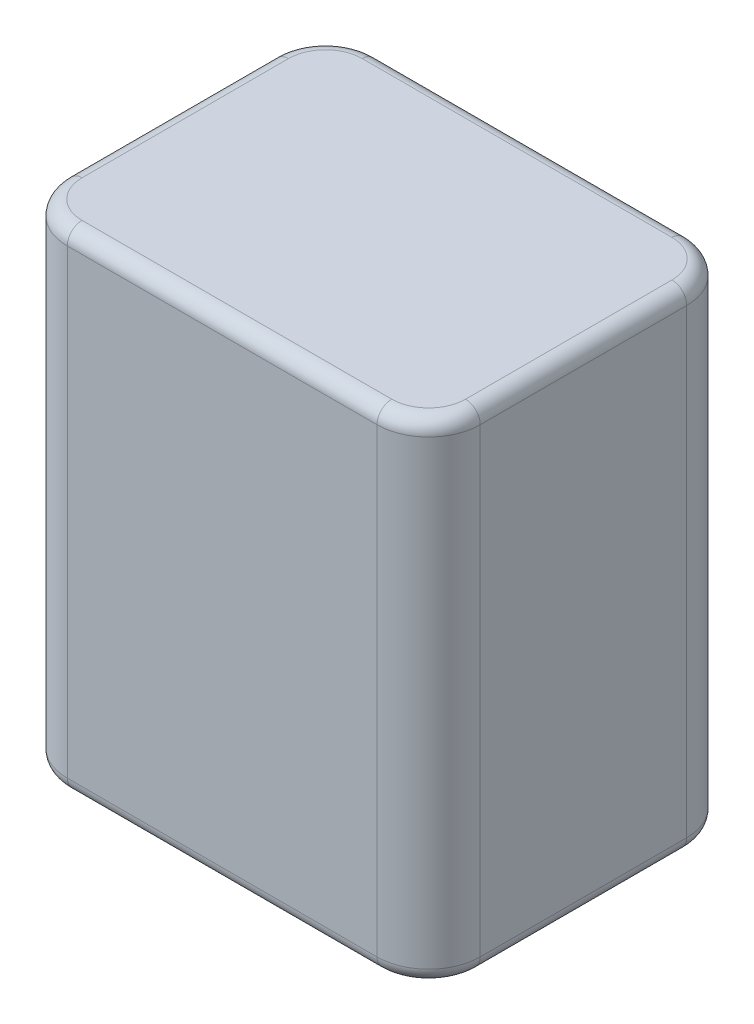
ISO-10303-21;
HEADER;
FILE_DESCRIPTION(('STEP AP214'),'2;1');
FILE_NAME('part.step','',(''),(''),'','','');
FILE_SCHEMA(('AUTOMOTIVE_DESIGN { 1 0 10303 214 1 1 1 1 }'));
ENDSEC;
DATA;
#1=APPLICATION_CONTEXT('core data for automotive mechanical design processes');
#2=APPLICATION_PROTOCOL_DEFINITION('international standard','automotive_design',2000,#1);
#3=PRODUCT_CONTEXT('',#1,'mechanical');
#4=PRODUCT('Part','Part','',(#3));
#5=PRODUCT_RELATED_PRODUCT_CATEGORY('part','',(#4));
#6=PRODUCT_DEFINITION_FORMATION('','',#4);
#7=PRODUCT_DEFINITION_CONTEXT('part definition',#1,'design');
#8=PRODUCT_DEFINITION('design','',#6,#7);
#9=PRODUCT_DEFINITION_SHAPE('','',#8);
#10=(LENGTH_UNIT() NAMED_UNIT(*) SI_UNIT(.MILLI.,.METRE.));
#11=(NAMED_UNIT(*) PLANE_ANGLE_UNIT() SI_UNIT($,.RADIAN.));
#12=(NAMED_UNIT(*) SI_UNIT($,.STERADIAN.) SOLID_ANGLE_UNIT());
#13=UNCERTAINTY_MEASURE_WITH_UNIT(LENGTH_MEASURE(1.E-05),#10,'distance_accuracy_value','');
#14=(GEOMETRIC_REPRESENTATION_CONTEXT(3) GLOBAL_UNCERTAINTY_ASSIGNED_CONTEXT((#13)) GLOBAL_UNIT_ASSIGNED_CONTEXT((#10,
#11,#12)) REPRESENTATION_CONTEXT('',''));
#15=CARTESIAN_POINT('',(0.,0.,0.));
#16=DIRECTION('',(0.,0.,1.));
#17=DIRECTION('',(1.,0.,0.));
#18=AXIS2_PLACEMENT_3D('',#15,#16,#17);
#19=CARTESIAN_POINT('',(-21.,66.5,14.));
#20=DIRECTION('',(0.,-1.,0.));
#21=DIRECTION('',(0.,0.,-1.));
#22=AXIS2_PLACEMENT_3D('',#19,#20,#21);
#23=CYLINDRICAL_SURFACE('',#22,7.);
#24=DIRECTION('',(0.,-1.,0.));
#25=VECTOR('',#24,1.);
#26=CARTESIAN_POINT('',(-28.,66.5,14.));
#27=LINE('',#26,#25);
#28=CARTESIAN_POINT('',(-28.,64.5,14.));
#29=VERTEX_POINT('',#28);
#30=CARTESIAN_POINT('',(-28.,2.,14.));
#31=VERTEX_POINT('',#30);
#32=EDGE_CURVE('E320',#29,#31,#27,.T.);
#33=ORIENTED_EDGE('',*,*,#32,.T.);
#34=CARTESIAN_POINT('',(-21.,2.,14.));
#35=DIRECTION('',(0.,-1.,0.));
#36=DIRECTION('',(0.,0.,-1.));
#37=AXIS2_PLACEMENT_3D('',#34,#35,#36);
#38=CIRCLE('',#37,7.);
#39=CARTESIAN_POINT('',(-21.,2.,21.));
#40=VERTEX_POINT('',#39);
#41=EDGE_CURVE('E269',#31,#40,#38,.F.);
#42=ORIENTED_EDGE('',*,*,#41,.T.);
#43=DIRECTION('',(0.,-1.,0.));
#44=VECTOR('',#43,1.);
#45=CARTESIAN_POINT('',(-21.,66.5,21.));
#46=LINE('',#45,#44);
#47=CARTESIAN_POINT('',(-21.,64.5,21.));
#48=VERTEX_POINT('',#47);
#49=EDGE_CURVE('E184',#48,#40,#46,.T.);
#50=ORIENTED_EDGE('',*,*,#49,.F.);
#51=CARTESIAN_POINT('',(-21.,64.5,14.));
#52=DIRECTION('',(0.,-1.,0.));
#53=DIRECTION('',(0.,0.,-1.));
#54=AXIS2_PLACEMENT_3D('',#51,#52,#53);
#55=CIRCLE('',#54,7.);
#56=EDGE_CURVE('E266',#48,#29,#55,.T.);
#57=ORIENTED_EDGE('',*,*,#56,.T.);
#58=EDGE_LOOP('',(#33,#42,#50,#57));
#59=FACE_BOUND('',#58,.T.);
#60=ADVANCED_FACE('F45',(#59),#23,.T.);
#61=CARTESIAN_POINT('',(-21.,66.5,21.));
#62=DIRECTION('',(0.,0.,-1.));
#63=DIRECTION('',(-1.,0.,0.));
#64=AXIS2_PLACEMENT_3D('',#61,#62,#63);
#65=PLANE('',#64);
#66=ORIENTED_EDGE('',*,*,#49,.T.);
#67=DIRECTION('',(1.,0.,0.));
#68=VECTOR('',#67,1.);
#69=CARTESIAN_POINT('',(20.9999999999999,2.,21.));
#70=LINE('',#69,#68);
#71=CARTESIAN_POINT('',(20.9999999999999,2.,21.));
#72=VERTEX_POINT('',#71);
#73=EDGE_CURVE('E182',#40,#72,#70,.T.);
#74=ORIENTED_EDGE('',*,*,#73,.T.);
#75=DIRECTION('',(0.,-1.,0.));
#76=VECTOR('',#75,1.);
#77=CARTESIAN_POINT('',(20.9999999999999,66.5,21.));
#78=LINE('',#77,#76);
#79=CARTESIAN_POINT('',(20.9999999999999,64.5,21.));
#80=VERTEX_POINT('',#79);
#81=EDGE_CURVE('E163',#80,#72,#78,.T.);
#82=ORIENTED_EDGE('',*,*,#81,.F.);
#83=DIRECTION('',(1.,0.,0.));
#84=VECTOR('',#83,1.);
#85=CARTESIAN_POINT('',(-21.,64.5,21.));
#86=LINE('',#85,#84);
#87=EDGE_CURVE('E179',#80,#48,#86,.F.);
#88=ORIENTED_EDGE('',*,*,#87,.T.);
#89=EDGE_LOOP('',(#66,#74,#82,#88));
#90=FACE_BOUND('',#89,.T.);
#91=ADVANCED_FACE('F177',(#90),#65,.F.);
#92=CARTESIAN_POINT('',(21.,66.5,14.));
#93=DIRECTION('',(0.,-1.,0.));
#94=DIRECTION('',(0.,0.,-1.));
#95=AXIS2_PLACEMENT_3D('',#92,#93,#94);
#96=CYLINDRICAL_SURFACE('',#95,7.);
#97=ORIENTED_EDGE('',*,*,#81,.T.);
#98=CARTESIAN_POINT('',(21.,2.,14.));
#99=DIRECTION('',(0.,-1.,0.));
#100=DIRECTION('',(0.,0.,-1.));
#101=AXIS2_PLACEMENT_3D('',#98,#99,#100);
#102=CIRCLE('',#101,7.);
#103=CARTESIAN_POINT('',(28.,2.,14.));
#104=VERTEX_POINT('',#103);
#105=EDGE_CURVE('E171',#72,#104,#102,.F.);
#106=ORIENTED_EDGE('',*,*,#105,.T.);
#107=DIRECTION('',(0.,-1.,0.));
#108=VECTOR('',#107,1.);
#109=CARTESIAN_POINT('',(28.,66.5,14.));
#110=LINE('',#109,#108);
#111=CARTESIAN_POINT('',(28.,64.5,14.));
#112=VERTEX_POINT('',#111);
#113=EDGE_CURVE('E165',#112,#104,#110,.T.);
#114=ORIENTED_EDGE('',*,*,#113,.F.);
#115=CARTESIAN_POINT('',(21.,64.5,14.));
#116=DIRECTION('',(0.,-1.,0.));
#117=DIRECTION('',(0.,0.,-1.));
#118=AXIS2_PLACEMENT_3D('',#115,#116,#117);
#119=CIRCLE('',#118,7.);
#120=EDGE_CURVE('E160',#112,#80,#119,.T.);
#121=ORIENTED_EDGE('',*,*,#120,.T.);
#122=EDGE_LOOP('',(#97,#106,#114,#121));
#123=FACE_BOUND('',#122,.T.);
#124=ADVANCED_FACE('F162',(#123),#96,.T.);
#125=CARTESIAN_POINT('',(28.,66.5,14.));
#126=DIRECTION('',(-1.,0.,0.));
#127=DIRECTION('',(0.,0.,1.));
#128=AXIS2_PLACEMENT_3D('',#125,#126,#127);
#129=PLANE('',#128);
#130=ORIENTED_EDGE('',*,*,#113,.T.);
#131=DIRECTION('',(0.,0.,-1.));
#132=VECTOR('',#131,1.);
#133=CARTESIAN_POINT('',(28.,2.,-13.9999999999999));
#134=LINE('',#133,#132);
#135=CARTESIAN_POINT('',(28.,2.,-13.9999999999999));
#136=VERTEX_POINT('',#135);
#137=EDGE_CURVE('E238',#104,#136,#134,.T.);
#138=ORIENTED_EDGE('',*,*,#137,.T.);
#139=DIRECTION('',(0.,-1.,0.));
#140=VECTOR('',#139,1.);
#141=CARTESIAN_POINT('',(28.,66.5,-13.9999999999999));
#142=LINE('',#141,#140);
#143=CARTESIAN_POINT('',(28.,64.5,-13.9999999999999));
#144=VERTEX_POINT('',#143);
#145=EDGE_CURVE('E352',#144,#136,#142,.T.);
#146=ORIENTED_EDGE('',*,*,#145,.F.);
#147=DIRECTION('',(0.,0.,-1.));
#148=VECTOR('',#147,1.);
#149=CARTESIAN_POINT('',(28.,64.5,14.));
#150=LINE('',#149,#148);
#151=EDGE_CURVE('E235',#144,#112,#150,.F.);
#152=ORIENTED_EDGE('',*,*,#151,.T.);
#153=EDGE_LOOP('',(#130,#138,#146,#152));
#154=FACE_BOUND('',#153,.T.);
#155=ADVANCED_FACE('F349',(#154),#129,.F.);
#156=CARTESIAN_POINT('',(21.,66.5,-14.));
#157=DIRECTION('',(0.,-1.,0.));
#158=DIRECTION('',(0.,0.,-1.));
#159=AXIS2_PLACEMENT_3D('',#156,#157,#158);
#160=CYLINDRICAL_SURFACE('',#159,7.);
#161=ORIENTED_EDGE('',*,*,#145,.T.);
#162=CARTESIAN_POINT('',(21.,2.,-14.));
#163=DIRECTION('',(0.,-1.,0.));
#164=DIRECTION('',(0.,0.,-1.));
#165=AXIS2_PLACEMENT_3D('',#162,#163,#164);
#166=CIRCLE('',#165,7.);
#167=CARTESIAN_POINT('',(21.,2.,-21.));
#168=VERTEX_POINT('',#167);
#169=EDGE_CURVE('E244',#136,#168,#166,.F.);
#170=ORIENTED_EDGE('',*,*,#169,.T.);
#171=DIRECTION('',(0.,-1.,0.));
#172=VECTOR('',#171,1.);
#173=CARTESIAN_POINT('',(21.,66.5,-21.));
#174=LINE('',#173,#172);
#175=CARTESIAN_POINT('',(21.,64.5,-21.));
#176=VERTEX_POINT('',#175);
#177=EDGE_CURVE('E356',#176,#168,#174,.T.);
#178=ORIENTED_EDGE('',*,*,#177,.F.);
#179=CARTESIAN_POINT('',(21.,64.5,-14.));
#180=DIRECTION('',(0.,-1.,0.));
#181=DIRECTION('',(0.,0.,-1.));
#182=AXIS2_PLACEMENT_3D('',#179,#180,#181);
#183=CIRCLE('',#182,7.);
#184=EDGE_CURVE('E241',#176,#144,#183,.T.);
#185=ORIENTED_EDGE('',*,*,#184,.T.);
#186=EDGE_LOOP('',(#161,#170,#178,#185));
#187=FACE_BOUND('',#186,.T.);
#188=ADVANCED_FACE('F406',(#187),#160,.T.);
#189=CARTESIAN_POINT('',(-21.,66.5,-21.));
#190=DIRECTION('',(0.,0.,1.));
#191=DIRECTION('',(1.,0.,0.));
#192=AXIS2_PLACEMENT_3D('',#189,#190,#191);
#193=PLANE('',#192);
#194=ORIENTED_EDGE('',*,*,#177,.T.);
#195=DIRECTION('',(-1.,0.,0.));
#196=VECTOR('',#195,1.);
#197=CARTESIAN_POINT('',(-21.,2.,-21.));
#198=LINE('',#197,#196);
#199=CARTESIAN_POINT('',(-21.,2.,-21.));
#200=VERTEX_POINT('',#199);
#201=EDGE_CURVE('E250',#168,#200,#198,.T.);
#202=ORIENTED_EDGE('',*,*,#201,.T.);
#203=DIRECTION('',(0.,-1.,0.));
#204=VECTOR('',#203,1.);
#205=CARTESIAN_POINT('',(-21.,66.5,-21.));
#206=LINE('',#205,#204);
#207=CARTESIAN_POINT('',(-21.,64.5,-21.));
#208=VERTEX_POINT('',#207);
#209=EDGE_CURVE('E362',#208,#200,#206,.T.);
#210=ORIENTED_EDGE('',*,*,#209,.F.);
#211=DIRECTION('',(-1.,0.,0.));
#212=VECTOR('',#211,1.);
#213=CARTESIAN_POINT('',(-21.,64.5,-21.));
#214=LINE('',#213,#212);
#215=EDGE_CURVE('E247',#208,#176,#214,.F.);
#216=ORIENTED_EDGE('',*,*,#215,.T.);
#217=EDGE_LOOP('',(#194,#202,#210,#216));
#218=FACE_BOUND('',#217,.T.);
#219=ADVANCED_FACE('F409',(#218),#193,.F.);
#220=CARTESIAN_POINT('',(-21.,66.5,-14.));
#221=DIRECTION('',(0.,-1.,0.));
#222=DIRECTION('',(0.,0.,-1.));
#223=AXIS2_PLACEMENT_3D('',#220,#221,#222);
#224=CYLINDRICAL_SURFACE('',#223,7.);
#225=ORIENTED_EDGE('',*,*,#209,.T.);
#226=CARTESIAN_POINT('',(-21.,2.,-14.));
#227=DIRECTION('',(0.,-1.,0.));
#228=DIRECTION('',(0.,0.,-1.));
#229=AXIS2_PLACEMENT_3D('',#226,#227,#228);
#230=CIRCLE('',#229,7.);
#231=CARTESIAN_POINT('',(-28.,2.,-13.9999999999999));
#232=VERTEX_POINT('',#231);
#233=EDGE_CURVE('E256',#200,#232,#230,.F.);
#234=ORIENTED_EDGE('',*,*,#233,.T.);
#235=DIRECTION('',(0.,-1.,0.));
#236=VECTOR('',#235,1.);
#237=CARTESIAN_POINT('',(-28.,66.5,-13.9999999999999));
#238=LINE('',#237,#236);
#239=CARTESIAN_POINT('',(-28.,64.5,-13.9999999999999));
#240=VERTEX_POINT('',#239);
#241=EDGE_CURVE('E368',#240,#232,#238,.T.);
#242=ORIENTED_EDGE('',*,*,#241,.F.);
#243=CARTESIAN_POINT('',(-21.,64.5,-14.));
#244=DIRECTION('',(0.,-1.,0.));
#245=DIRECTION('',(0.,0.,-1.));
#246=AXIS2_PLACEMENT_3D('',#243,#244,#245);
#247=CIRCLE('',#246,7.);
#248=EDGE_CURVE('E253',#240,#208,#247,.T.);
#249=ORIENTED_EDGE('',*,*,#248,.T.);
#250=EDGE_LOOP('',(#225,#234,#242,#249));
#251=FACE_BOUND('',#250,.T.);
#252=ADVANCED_FACE('F423',(#251),#224,.T.);
#253=CARTESIAN_POINT('',(-28.,66.5,14.));
#254=DIRECTION('',(1.,0.,0.));
#255=DIRECTION('',(0.,0.,-1.));
#256=AXIS2_PLACEMENT_3D('',#253,#254,#255);
#257=PLANE('',#256);
#258=ORIENTED_EDGE('',*,*,#241,.T.);
#259=DIRECTION('',(0.,0.,1.));
#260=VECTOR('',#259,1.);
#261=CARTESIAN_POINT('',(-28.,2.,14.));
#262=LINE('',#261,#260);
#263=EDGE_CURVE('E263',#232,#31,#262,.T.);
#264=ORIENTED_EDGE('',*,*,#263,.T.);
#265=ORIENTED_EDGE('',*,*,#32,.F.);
#266=DIRECTION('',(0.,0.,1.));
#267=VECTOR('',#266,1.);
#268=CARTESIAN_POINT('',(-28.,64.5,14.));
#269=LINE('',#268,#267);
#270=EDGE_CURVE('E259',#29,#240,#269,.F.);
#271=ORIENTED_EDGE('',*,*,#270,.T.);
#272=EDGE_LOOP('',(#258,#264,#265,#271));
#273=FACE_BOUND('',#272,.T.);
#274=ADVANCED_FACE('F424',(#273),#257,.F.);
#275=CARTESIAN_POINT('',(-21.,66.5,14.));
#276=DIRECTION('',(0.,-1.,0.));
#277=DIRECTION('',(0.,0.,-1.));
#278=AXIS2_PLACEMENT_3D('',#275,#276,#277);
#279=PLANE('',#278);
#280=CARTESIAN_POINT('',(-21.,66.5,-14.));
#281=DIRECTION('',(0.,-1.,0.));
#282=DIRECTION('',(0.,0.,-1.));
#283=AXIS2_PLACEMENT_3D('',#280,#281,#282);
#284=CIRCLE('',#283,5.);
#285=CARTESIAN_POINT('',(-21.,66.5,-19.));
#286=VERTEX_POINT('',#285);
#287=CARTESIAN_POINT('',(-26.,66.5,-13.9999999999999));
#288=VERTEX_POINT('',#287);
#289=EDGE_CURVE('E55',#286,#288,#284,.F.);
#290=ORIENTED_EDGE('',*,*,#289,.T.);
#291=DIRECTION('',(0.,0.,1.));
#292=VECTOR('',#291,1.);
#293=CARTESIAN_POINT('',(-26.,66.5,14.));
#294=LINE('',#293,#292);
#295=CARTESIAN_POINT('',(-26.,66.5,14.));
#296=VERTEX_POINT('',#295);
#297=EDGE_CURVE('E11',#288,#296,#294,.T.);
#298=ORIENTED_EDGE('',*,*,#297,.T.);
#299=CARTESIAN_POINT('',(-21.,66.5,14.));
#300=DIRECTION('',(0.,-1.,0.));
#301=DIRECTION('',(0.,0.,-1.));
#302=AXIS2_PLACEMENT_3D('',#299,#300,#301);
#303=CIRCLE('',#302,5.);
#304=CARTESIAN_POINT('',(-21.,66.5,19.));
#305=VERTEX_POINT('',#304);
#306=EDGE_CURVE('E272',#296,#305,#303,.F.);
#307=ORIENTED_EDGE('',*,*,#306,.T.);
#308=DIRECTION('',(1.,0.,0.));
#309=VECTOR('',#308,1.);
#310=CARTESIAN_POINT('',(-21.,66.5,19.));
#311=LINE('',#310,#309);
#312=CARTESIAN_POINT('',(21.,66.5,19.));
#313=VERTEX_POINT('',#312);
#314=EDGE_CURVE('E275',#305,#313,#311,.T.);
#315=ORIENTED_EDGE('',*,*,#314,.T.);
#316=CARTESIAN_POINT('',(21.,66.5,14.));
#317=DIRECTION('',(0.,-1.,0.));
#318=DIRECTION('',(0.,0.,-1.));
#319=AXIS2_PLACEMENT_3D('',#316,#317,#318);
#320=CIRCLE('',#319,5.);
#321=CARTESIAN_POINT('',(26.,66.5,14.));
#322=VERTEX_POINT('',#321);
#323=EDGE_CURVE('E190',#313,#322,#320,.F.);
#324=ORIENTED_EDGE('',*,*,#323,.T.);
#325=DIRECTION('',(0.,0.,-1.));
#326=VECTOR('',#325,1.);
#327=CARTESIAN_POINT('',(26.,66.5,14.));
#328=LINE('',#327,#326);
#329=CARTESIAN_POINT('',(26.,66.5,-14.));
#330=VERTEX_POINT('',#329);
#331=EDGE_CURVE('E280',#322,#330,#328,.T.);
#332=ORIENTED_EDGE('',*,*,#331,.T.);
#333=CARTESIAN_POINT('',(21.,66.5,-14.));
#334=DIRECTION('',(0.,-1.,0.));
#335=DIRECTION('',(0.,0.,-1.));
#336=AXIS2_PLACEMENT_3D('',#333,#334,#335);
#337=CIRCLE('',#336,5.);
#338=CARTESIAN_POINT('',(21.,66.5,-19.));
#339=VERTEX_POINT('',#338);
#340=EDGE_CURVE('E283',#330,#339,#337,.F.);
#341=ORIENTED_EDGE('',*,*,#340,.T.);
#342=DIRECTION('',(-1.,0.,0.));
#343=VECTOR('',#342,1.);
#344=CARTESIAN_POINT('',(-21.,66.5,-19.));
#345=LINE('',#344,#343);
#346=EDGE_CURVE('E66',#339,#286,#345,.T.);
#347=ORIENTED_EDGE('',*,*,#346,.T.);
#348=EDGE_LOOP('',(#290,#298,#307,#315,#324,#332,#341,#347));
#349=FACE_BOUND('',#348,.T.);
#350=ADVANCED_FACE('F433',(#349),#279,.F.);
#351=CARTESIAN_POINT('',(-21.,0.,14.));
#352=DIRECTION('',(0.,-1.,0.));
#353=DIRECTION('',(0.,0.,-1.));
#354=AXIS2_PLACEMENT_3D('',#351,#352,#353);
#355=PLANE('',#354);
#356=CARTESIAN_POINT('',(21.,0.,14.));
#357=DIRECTION('',(0.,-1.,0.));
#358=DIRECTION('',(0.,0.,-1.));
#359=AXIS2_PLACEMENT_3D('',#356,#357,#358);
#360=CIRCLE('',#359,5.);
#361=CARTESIAN_POINT('',(26.,0.,14.));
#362=VERTEX_POINT('',#361);
#363=CARTESIAN_POINT('',(20.9999999999999,0.,19.));
#364=VERTEX_POINT('',#363);
#365=EDGE_CURVE('E227',#362,#364,#360,.T.);
#366=ORIENTED_EDGE('',*,*,#365,.T.);
#367=DIRECTION('',(1.,0.,0.));
#368=VECTOR('',#367,1.);
#369=CARTESIAN_POINT('',(-21.,0.,19.));
#370=LINE('',#369,#368);
#371=CARTESIAN_POINT('',(-21.,0.,19.));
#372=VERTEX_POINT('',#371);
#373=EDGE_CURVE('E172',#364,#372,#370,.F.);
#374=ORIENTED_EDGE('',*,*,#373,.T.);
#375=CARTESIAN_POINT('',(-21.,0.,14.));
#376=DIRECTION('',(0.,-1.,0.));
#377=DIRECTION('',(0.,0.,-1.));
#378=AXIS2_PLACEMENT_3D('',#375,#376,#377);
#379=CIRCLE('',#378,5.);
#380=CARTESIAN_POINT('',(-26.,0.,14.));
#381=VERTEX_POINT('',#380);
#382=EDGE_CURVE('E206',#372,#381,#379,.T.);
#383=ORIENTED_EDGE('',*,*,#382,.T.);
#384=DIRECTION('',(0.,0.,1.));
#385=VECTOR('',#384,1.);
#386=CARTESIAN_POINT('',(-26.,0.,-13.9999999999999));
#387=LINE('',#386,#385);
#388=CARTESIAN_POINT('',(-26.,0.,-14.));
#389=VERTEX_POINT('',#388);
#390=EDGE_CURVE('E212',#381,#389,#387,.F.);
#391=ORIENTED_EDGE('',*,*,#390,.T.);
#392=CARTESIAN_POINT('',(-21.,0.,-14.));
#393=DIRECTION('',(0.,-1.,0.));
#394=DIRECTION('',(0.,0.,-1.));
#395=AXIS2_PLACEMENT_3D('',#392,#393,#394);
#396=CIRCLE('',#395,5.);
#397=CARTESIAN_POINT('',(-21.,0.,-19.));
#398=VERTEX_POINT('',#397);
#399=EDGE_CURVE('E215',#389,#398,#396,.T.);
#400=ORIENTED_EDGE('',*,*,#399,.T.);
#401=DIRECTION('',(-1.,0.,0.));
#402=VECTOR('',#401,1.);
#403=CARTESIAN_POINT('',(21.,0.,-19.));
#404=LINE('',#403,#402);
#405=CARTESIAN_POINT('',(21.,0.,-19.));
#406=VERTEX_POINT('',#405);
#407=EDGE_CURVE('E218',#398,#406,#404,.F.);
#408=ORIENTED_EDGE('',*,*,#407,.T.);
#409=CARTESIAN_POINT('',(21.,0.,-14.));
#410=DIRECTION('',(0.,-1.,0.));
#411=DIRECTION('',(0.,0.,-1.));
#412=AXIS2_PLACEMENT_3D('',#409,#410,#411);
#413=CIRCLE('',#412,5.);
#414=CARTESIAN_POINT('',(26.,0.,-13.9999999999999));
#415=VERTEX_POINT('',#414);
#416=EDGE_CURVE('E221',#406,#415,#413,.T.);
#417=ORIENTED_EDGE('',*,*,#416,.T.);
#418=DIRECTION('',(0.,0.,-1.));
#419=VECTOR('',#418,1.);
#420=CARTESIAN_POINT('',(26.,0.,14.));
#421=LINE('',#420,#419);
#422=EDGE_CURVE('E224',#415,#362,#421,.F.);
#423=ORIENTED_EDGE('',*,*,#422,.T.);
#424=EDGE_LOOP('',(#366,#374,#383,#391,#400,#408,#417,#423));
#425=FACE_BOUND('',#424,.T.);
#426=ADVANCED_FACE('F435',(#425),#355,.T.);
#427=CARTESIAN_POINT('',(-21.,2.,-19.));
#428=DIRECTION('',(1.,0.,0.));
#429=DIRECTION('',(0.,0.,-1.));
#430=AXIS2_PLACEMENT_3D('',#427,#428,#429);
#431=CYLINDRICAL_SURFACE('',#430,2.);
#432=CARTESIAN_POINT('',(21.,2.,-19.));
#433=DIRECTION('',(1.,0.,0.));
#434=DIRECTION('',(0.,0.,-1.));
#435=AXIS2_PLACEMENT_3D('',#432,#433,#434);
#436=CIRCLE('',#435,2.);
#437=EDGE_CURVE('E312',#406,#168,#436,.T.);
#438=ORIENTED_EDGE('',*,*,#437,.F.);
#439=ORIENTED_EDGE('',*,*,#407,.F.);
#440=CARTESIAN_POINT('',(-21.,2.,-19.));
#441=DIRECTION('',(-1.,0.,0.));
#442=DIRECTION('',(0.,0.,1.));
#443=AXIS2_PLACEMENT_3D('',#440,#441,#442);
#444=CIRCLE('',#443,2.);
#445=EDGE_CURVE('E316',#200,#398,#444,.T.);
#446=ORIENTED_EDGE('',*,*,#445,.F.);
#447=ORIENTED_EDGE('',*,*,#201,.F.);
#448=EDGE_LOOP('',(#438,#439,#446,#447));
#449=FACE_BOUND('',#448,.T.);
#450=ADVANCED_FACE('F414',(#449),#431,.T.);
#451=CARTESIAN_POINT('',(-21.,2.,-14.));
#452=DIRECTION('',(0.,-1.,0.));
#453=DIRECTION('',(0.,0.,-1.));
#454=AXIS2_PLACEMENT_3D('',#451,#452,#453);
#455=TOROIDAL_SURFACE('',#454,5.,2.);
#456=ORIENTED_EDGE('',*,*,#445,.T.);
#457=ORIENTED_EDGE('',*,*,#399,.F.);
#458=CARTESIAN_POINT('',(-26.,2.,-14.));
#459=DIRECTION('',(0.,0.,1.));
#460=DIRECTION('',(1.,0.,0.));
#461=AXIS2_PLACEMENT_3D('',#458,#459,#460);
#462=CIRCLE('',#461,2.);
#463=EDGE_CURVE('E308',#232,#389,#462,.T.);
#464=ORIENTED_EDGE('',*,*,#463,.F.);
#465=ORIENTED_EDGE('',*,*,#233,.F.);
#466=EDGE_LOOP('',(#456,#457,#464,#465));
#467=FACE_BOUND('',#466,.T.);
#468=ADVANCED_FACE('F420',(#467),#455,.T.);
#469=CARTESIAN_POINT('',(21.,2.,-14.));
#470=DIRECTION('',(0.,-1.,0.));
#471=DIRECTION('',(0.,0.,-1.));
#472=AXIS2_PLACEMENT_3D('',#469,#470,#471);
#473=TOROIDAL_SURFACE('',#472,5.,2.);
#474=ORIENTED_EDGE('',*,*,#437,.T.);
#475=ORIENTED_EDGE('',*,*,#169,.F.);
#476=CARTESIAN_POINT('',(26.,2.,-13.9999999999999));
#477=DIRECTION('',(0.,0.,1.));
#478=DIRECTION('',(1.,0.,0.));
#479=AXIS2_PLACEMENT_3D('',#476,#477,#478);
#480=CIRCLE('',#479,2.);
#481=EDGE_CURVE('E304',#415,#136,#480,.T.);
#482=ORIENTED_EDGE('',*,*,#481,.F.);
#483=ORIENTED_EDGE('',*,*,#416,.F.);
#484=EDGE_LOOP('',(#474,#475,#482,#483));
#485=FACE_BOUND('',#484,.T.);
#486=ADVANCED_FACE('F403',(#485),#473,.T.);
#487=CARTESIAN_POINT('',(-26.,2.,14.));
#488=DIRECTION('',(0.,0.,-1.));
#489=DIRECTION('',(-1.,0.,0.));
#490=AXIS2_PLACEMENT_3D('',#487,#488,#489);
#491=CYLINDRICAL_SURFACE('',#490,2.);
#492=ORIENTED_EDGE('',*,*,#463,.T.);
#493=ORIENTED_EDGE('',*,*,#390,.F.);
#494=CARTESIAN_POINT('',(-26.,2.,14.));
#495=DIRECTION('',(0.,0.,1.));
#496=DIRECTION('',(1.,0.,0.));
#497=AXIS2_PLACEMENT_3D('',#494,#495,#496);
#498=CIRCLE('',#497,2.);
#499=EDGE_CURVE('E300',#31,#381,#498,.T.);
#500=ORIENTED_EDGE('',*,*,#499,.F.);
#501=ORIENTED_EDGE('',*,*,#263,.F.);
#502=EDGE_LOOP('',(#492,#493,#500,#501));
#503=FACE_BOUND('',#502,.T.);
#504=ADVANCED_FACE('F383',(#503),#491,.T.);
#505=CARTESIAN_POINT('',(26.,2.,14.));
#506=DIRECTION('',(0.,0.,1.));
#507=DIRECTION('',(1.,0.,0.));
#508=AXIS2_PLACEMENT_3D('',#505,#506,#507);
#509=CYLINDRICAL_SURFACE('',#508,2.);
#510=ORIENTED_EDGE('',*,*,#481,.T.);
#511=ORIENTED_EDGE('',*,*,#137,.F.);
#512=CARTESIAN_POINT('',(26.,2.,14.));
#513=DIRECTION('',(0.,0.,1.));
#514=DIRECTION('',(1.,0.,0.));
#515=AXIS2_PLACEMENT_3D('',#512,#513,#514);
#516=CIRCLE('',#515,2.);
#517=EDGE_CURVE('E296',#362,#104,#516,.T.);
#518=ORIENTED_EDGE('',*,*,#517,.F.);
#519=ORIENTED_EDGE('',*,*,#422,.F.);
#520=EDGE_LOOP('',(#510,#511,#518,#519));
#521=FACE_BOUND('',#520,.T.);
#522=ADVANCED_FACE('F399',(#521),#509,.T.);
#523=CARTESIAN_POINT('',(-21.,2.,14.));
#524=DIRECTION('',(0.,-1.,0.));
#525=DIRECTION('',(0.,0.,-1.));
#526=AXIS2_PLACEMENT_3D('',#523,#524,#525);
#527=TOROIDAL_SURFACE('',#526,5.,2.);
#528=ORIENTED_EDGE('',*,*,#499,.T.);
#529=ORIENTED_EDGE('',*,*,#382,.F.);
#530=CARTESIAN_POINT('',(-21.,2.,19.));
#531=DIRECTION('',(1.,0.,0.));
#532=DIRECTION('',(0.,0.,-1.));
#533=AXIS2_PLACEMENT_3D('',#530,#531,#532);
#534=CIRCLE('',#533,2.);
#535=EDGE_CURVE('E293',#40,#372,#534,.T.);
#536=ORIENTED_EDGE('',*,*,#535,.F.);
#537=ORIENTED_EDGE('',*,*,#41,.F.);
#538=EDGE_LOOP('',(#528,#529,#536,#537));
#539=FACE_BOUND('',#538,.T.);
#540=ADVANCED_FACE('F387',(#539),#527,.T.);
#541=CARTESIAN_POINT('',(21.,2.,14.));
#542=DIRECTION('',(0.,-1.,0.));
#543=DIRECTION('',(0.,0.,-1.));
#544=AXIS2_PLACEMENT_3D('',#541,#542,#543);
#545=TOROIDAL_SURFACE('',#544,5.,2.);
#546=ORIENTED_EDGE('',*,*,#517,.T.);
#547=ORIENTED_EDGE('',*,*,#105,.F.);
#548=CARTESIAN_POINT('',(20.9999999999999,2.,19.));
#549=DIRECTION('',(-1.,0.,0.));
#550=DIRECTION('',(0.,0.,1.));
#551=AXIS2_PLACEMENT_3D('',#548,#549,#550);
#552=CIRCLE('',#551,2.);
#553=EDGE_CURVE('E290',#364,#72,#552,.T.);
#554=ORIENTED_EDGE('',*,*,#553,.F.);
#555=ORIENTED_EDGE('',*,*,#365,.F.);
#556=EDGE_LOOP('',(#546,#547,#554,#555));
#557=FACE_BOUND('',#556,.T.);
#558=ADVANCED_FACE('F395',(#557),#545,.T.);
#559=CARTESIAN_POINT('',(-21.,2.,19.));
#560=DIRECTION('',(-1.,0.,0.));
#561=DIRECTION('',(0.,0.,1.));
#562=AXIS2_PLACEMENT_3D('',#559,#560,#561);
#563=CYLINDRICAL_SURFACE('',#562,2.);
#564=ORIENTED_EDGE('',*,*,#535,.T.);
#565=ORIENTED_EDGE('',*,*,#373,.F.);
#566=ORIENTED_EDGE('',*,*,#553,.T.);
#567=ORIENTED_EDGE('',*,*,#73,.F.);
#568=EDGE_LOOP('',(#564,#565,#566,#567));
#569=FACE_BOUND('',#568,.T.);
#570=ADVANCED_FACE('F390',(#569),#563,.T.);
#571=CARTESIAN_POINT('',(26.,64.5,14.));
#572=DIRECTION('',(0.,0.,-1.));
#573=DIRECTION('',(-1.,0.,0.));
#574=AXIS2_PLACEMENT_3D('',#571,#572,#573);
#575=CYLINDRICAL_SURFACE('',#574,2.);
#576=CARTESIAN_POINT('',(26.,64.5,14.));
#577=DIRECTION('',(0.,0.,1.));
#578=DIRECTION('',(1.,0.,0.));
#579=AXIS2_PLACEMENT_3D('',#576,#577,#578);
#580=CIRCLE('',#579,2.);
#581=EDGE_CURVE('E334',#112,#322,#580,.T.);
#582=ORIENTED_EDGE('',*,*,#581,.F.);
#583=ORIENTED_EDGE('',*,*,#151,.F.);
#584=CARTESIAN_POINT('',(26.,64.5,-14.));
#585=DIRECTION('',(0.,0.,-1.));
#586=DIRECTION('',(-1.,0.,0.));
#587=AXIS2_PLACEMENT_3D('',#584,#585,#586);
#588=CIRCLE('',#587,2.);
#589=EDGE_CURVE('E49',#330,#144,#588,.T.);
#590=ORIENTED_EDGE('',*,*,#589,.F.);
#591=ORIENTED_EDGE('',*,*,#331,.F.);
#592=EDGE_LOOP('',(#582,#583,#590,#591));
#593=FACE_BOUND('',#592,.T.);
#594=ADVANCED_FACE('F47',(#593),#575,.T.);
#595=CARTESIAN_POINT('',(21.,64.5,-14.));
#596=DIRECTION('',(0.,-1.,0.));
#597=DIRECTION('',(0.,0.,-1.));
#598=AXIS2_PLACEMENT_3D('',#595,#596,#597);
#599=TOROIDAL_SURFACE('',#598,5.,2.);
#600=ORIENTED_EDGE('',*,*,#589,.T.);
#601=ORIENTED_EDGE('',*,*,#184,.F.);
#602=CARTESIAN_POINT('',(21.,64.5,-19.));
#603=DIRECTION('',(-1.,0.,0.));
#604=DIRECTION('',(0.,0.,1.));
#605=AXIS2_PLACEMENT_3D('',#602,#603,#604);
#606=CIRCLE('',#605,2.);
#607=EDGE_CURVE('E194',#339,#176,#606,.T.);
#608=ORIENTED_EDGE('',*,*,#607,.F.);
#609=ORIENTED_EDGE('',*,*,#340,.F.);
#610=EDGE_LOOP('',(#600,#601,#608,#609));
#611=FACE_BOUND('',#610,.T.);
#612=ADVANCED_FACE('F342',(#611),#599,.T.);
#613=CARTESIAN_POINT('',(21.,64.5,14.));
#614=DIRECTION('',(0.,-1.,0.));
#615=DIRECTION('',(0.,0.,-1.));
#616=AXIS2_PLACEMENT_3D('',#613,#614,#615);
#617=TOROIDAL_SURFACE('',#616,5.,2.);
#618=ORIENTED_EDGE('',*,*,#581,.T.);
#619=ORIENTED_EDGE('',*,*,#323,.F.);
#620=CARTESIAN_POINT('',(21.,64.5,19.));
#621=DIRECTION('',(-1.,0.,0.));
#622=DIRECTION('',(0.,0.,1.));
#623=AXIS2_PLACEMENT_3D('',#620,#621,#622);
#624=CIRCLE('',#623,2.);
#625=EDGE_CURVE('E188',#80,#313,#624,.T.);
#626=ORIENTED_EDGE('',*,*,#625,.F.);
#627=ORIENTED_EDGE('',*,*,#120,.F.);
#628=EDGE_LOOP('',(#618,#619,#626,#627));
#629=FACE_BOUND('',#628,.T.);
#630=ADVANCED_FACE('F189',(#629),#617,.T.);
#631=CARTESIAN_POINT('',(-21.,64.5,-19.));
#632=DIRECTION('',(-1.,0.,0.));
#633=DIRECTION('',(0.,0.,1.));
#634=AXIS2_PLACEMENT_3D('',#631,#632,#633);
#635=CYLINDRICAL_SURFACE('',#634,2.);
#636=ORIENTED_EDGE('',*,*,#607,.T.);
#637=ORIENTED_EDGE('',*,*,#215,.F.);
#638=CARTESIAN_POINT('',(-21.,64.5,-19.));
#639=DIRECTION('',(-1.,0.,0.));
#640=DIRECTION('',(0.,0.,1.));
#641=AXIS2_PLACEMENT_3D('',#638,#639,#640);
#642=CIRCLE('',#641,2.);
#643=EDGE_CURVE('E195',#286,#208,#642,.T.);
#644=ORIENTED_EDGE('',*,*,#643,.F.);
#645=ORIENTED_EDGE('',*,*,#346,.F.);
#646=EDGE_LOOP('',(#636,#637,#644,#645));
#647=FACE_BOUND('',#646,.T.);
#648=ADVANCED_FACE('F478',(#647),#635,.T.);
#649=CARTESIAN_POINT('',(-21.,64.5,19.));
#650=DIRECTION('',(1.,0.,0.));
#651=DIRECTION('',(0.,0.,-1.));
#652=AXIS2_PLACEMENT_3D('',#649,#650,#651);
#653=CYLINDRICAL_SURFACE('',#652,2.);
#654=ORIENTED_EDGE('',*,*,#625,.T.);
#655=ORIENTED_EDGE('',*,*,#314,.F.);
#656=CARTESIAN_POINT('',(-21.,64.5,19.));
#657=DIRECTION('',(-1.,0.,0.));
#658=DIRECTION('',(0.,0.,1.));
#659=AXIS2_PLACEMENT_3D('',#656,#657,#658);
#660=CIRCLE('',#659,2.);
#661=EDGE_CURVE('E200',#48,#305,#660,.T.);
#662=ORIENTED_EDGE('',*,*,#661,.F.);
#663=ORIENTED_EDGE('',*,*,#87,.F.);
#664=EDGE_LOOP('',(#654,#655,#662,#663));
#665=FACE_BOUND('',#664,.T.);
#666=ADVANCED_FACE('F198',(#665),#653,.T.);
#667=CARTESIAN_POINT('',(-21.,64.5,-14.));
#668=DIRECTION('',(0.,-1.,0.));
#669=DIRECTION('',(0.,0.,-1.));
#670=AXIS2_PLACEMENT_3D('',#667,#668,#669);
#671=TOROIDAL_SURFACE('',#670,5.,2.);
#672=ORIENTED_EDGE('',*,*,#643,.T.);
#673=ORIENTED_EDGE('',*,*,#248,.F.);
#674=CARTESIAN_POINT('',(-26.,64.5,-13.9999999999999));
#675=DIRECTION('',(0.,0.,1.));
#676=DIRECTION('',(1.,0.,0.));
#677=AXIS2_PLACEMENT_3D('',#674,#675,#676);
#678=CIRCLE('',#677,2.);
#679=EDGE_CURVE('E324',#288,#240,#678,.T.);
#680=ORIENTED_EDGE('',*,*,#679,.F.);
#681=ORIENTED_EDGE('',*,*,#289,.F.);
#682=EDGE_LOOP('',(#672,#673,#680,#681));
#683=FACE_BOUND('',#682,.T.);
#684=ADVANCED_FACE('F472',(#683),#671,.T.);
#685=CARTESIAN_POINT('',(-21.,64.5,14.));
#686=DIRECTION('',(0.,-1.,0.));
#687=DIRECTION('',(0.,0.,-1.));
#688=AXIS2_PLACEMENT_3D('',#685,#686,#687);
#689=TOROIDAL_SURFACE('',#688,5.,2.);
#690=ORIENTED_EDGE('',*,*,#661,.T.);
#691=ORIENTED_EDGE('',*,*,#306,.F.);
#692=CARTESIAN_POINT('',(-26.,64.5,14.));
#693=DIRECTION('',(0.,0.,-1.));
#694=DIRECTION('',(-1.,0.,0.));
#695=AXIS2_PLACEMENT_3D('',#692,#693,#694);
#696=CIRCLE('',#695,2.);
#697=EDGE_CURVE('E321',#29,#296,#696,.T.);
#698=ORIENTED_EDGE('',*,*,#697,.F.);
#699=ORIENTED_EDGE('',*,*,#56,.F.);
#700=EDGE_LOOP('',(#690,#691,#698,#699));
#701=FACE_BOUND('',#700,.T.);
#702=ADVANCED_FACE('F432',(#701),#689,.T.);
#703=CARTESIAN_POINT('',(-26.,64.5,14.));
#704=DIRECTION('',(0.,0.,1.));
#705=DIRECTION('',(1.,0.,0.));
#706=AXIS2_PLACEMENT_3D('',#703,#704,#705);
#707=CYLINDRICAL_SURFACE('',#706,2.);
#708=ORIENTED_EDGE('',*,*,#679,.T.);
#709=ORIENTED_EDGE('',*,*,#270,.F.);
#710=ORIENTED_EDGE('',*,*,#697,.T.);
#711=ORIENTED_EDGE('',*,*,#297,.F.);
#712=EDGE_LOOP('',(#708,#709,#710,#711));
#713=FACE_BOUND('',#712,.T.);
#714=ADVANCED_FACE('F427',(#713),#707,.T.);
#715=CLOSED_SHELL('',(#60,#91,#124,#155,#188,#219,#252,#274,#350,#426,#450,#468,#486,#504,#522,
#540,#558,#570,#594,#612,#630,#648,#666,#684,#702,#714));
#716=MANIFOLD_SOLID_BREP('B2',#715);
#717=ADVANCED_BREP_SHAPE_REPRESENTATION('',(#18,#716),#14);
#718=SHAPE_DEFINITION_REPRESENTATION(#9,#717);
ENDSEC;
END-ISO-10303-21;
